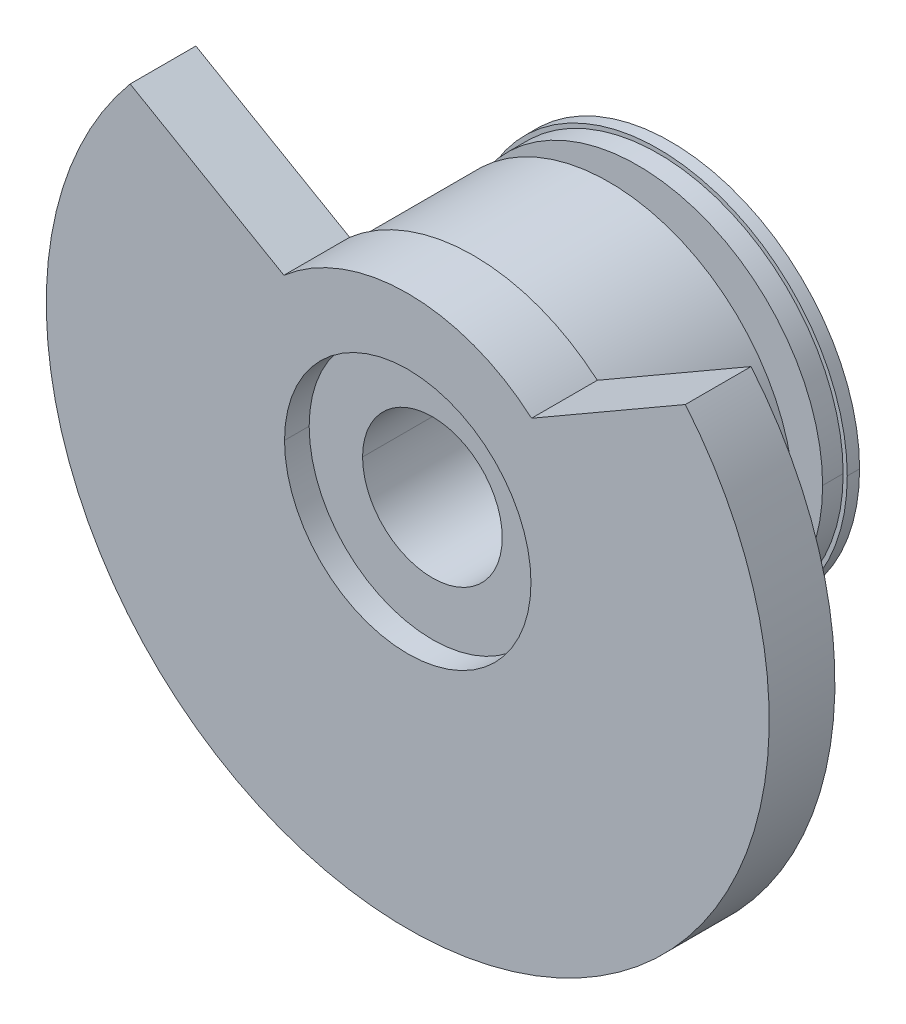
ISO-10303-21;
HEADER;
FILE_DESCRIPTION(('STEP AP214'),'2;1');
FILE_NAME('part.step','',(''),(''),'','','');
FILE_SCHEMA(('AUTOMOTIVE_DESIGN { 1 0 10303 214 1 1 1 1 }'));
ENDSEC;
DATA;
#1=APPLICATION_CONTEXT('core data for automotive mechanical design processes');
#2=APPLICATION_PROTOCOL_DEFINITION('international standard','automotive_design',2000,#1);
#3=PRODUCT_CONTEXT('',#1,'mechanical');
#4=PRODUCT('Part','Part','',(#3));
#5=PRODUCT_RELATED_PRODUCT_CATEGORY('part','',(#4));
#6=PRODUCT_DEFINITION_FORMATION('','',#4);
#7=PRODUCT_DEFINITION_CONTEXT('part definition',#1,'design');
#8=PRODUCT_DEFINITION('design','',#6,#7);
#9=PRODUCT_DEFINITION_SHAPE('','',#8);
#10=(LENGTH_UNIT() NAMED_UNIT(*) SI_UNIT(.MILLI.,.METRE.));
#11=(NAMED_UNIT(*) PLANE_ANGLE_UNIT() SI_UNIT($,.RADIAN.));
#12=(NAMED_UNIT(*) SI_UNIT($,.STERADIAN.) SOLID_ANGLE_UNIT());
#13=UNCERTAINTY_MEASURE_WITH_UNIT(LENGTH_MEASURE(1.E-05),#10,'distance_accuracy_value','');
#14=(GEOMETRIC_REPRESENTATION_CONTEXT(3) GLOBAL_UNCERTAINTY_ASSIGNED_CONTEXT((#13)) GLOBAL_UNIT_ASSIGNED_CONTEXT((#10,
#11,#12)) REPRESENTATION_CONTEXT('',''));
#15=CARTESIAN_POINT('',(0.,0.,0.));
#16=DIRECTION('',(0.,0.,1.));
#17=DIRECTION('',(1.,0.,0.));
#18=AXIS2_PLACEMENT_3D('',#15,#16,#17);
#19=CARTESIAN_POINT('',(0.,0.,-34.));
#20=DIRECTION('',(0.,0.,1.));
#21=DIRECTION('',(0.,-1.,0.));
#22=AXIS2_PLACEMENT_3D('',#19,#20,#21);
#23=CONICAL_SURFACE('',#22,19.5358983849,1.0471975512);
#24=CARTESIAN_POINT('',(0.,0.,-32.));
#25=DIRECTION('',(0.,0.,1.));
#26=DIRECTION('',(1.,0.,0.));
#27=AXIS2_PLACEMENT_3D('',#24,#25,#26);
#28=CIRCLE('',#27,23.);
#29=CARTESIAN_POINT('',(23.,0.,-32.));
#30=VERTEX_POINT('',#29);
#31=CARTESIAN_POINT('',(-23.0000000000162,0.,-32.0000000000281));
#32=VERTEX_POINT('',#31);
#33=EDGE_CURVE('E11',#30,#32,#28,.T.);
#34=ORIENTED_EDGE('',*,*,#33,.F.);
#35=DIRECTION('',(0.86602540378614,0.,0.499999999997053));
#36=VECTOR('',#35,1.);
#37=CARTESIAN_POINT('',(19.5358983849,0.,-34.));
#38=LINE('',#37,#36);
#39=CARTESIAN_POINT('',(19.535898384862,0.,-34.));
#40=VERTEX_POINT('',#39);
#41=EDGE_CURVE('E25',#40,#30,#38,.T.);
#42=ORIENTED_EDGE('',*,*,#41,.F.);
#43=CARTESIAN_POINT('',(0.,0.,-34.));
#44=DIRECTION('',(0.,0.,1.));
#45=DIRECTION('',(1.,0.,0.));
#46=AXIS2_PLACEMENT_3D('',#43,#44,#45);
#47=CIRCLE('',#46,19.5358983849);
#48=CARTESIAN_POINT('',(-19.5358983849,0.,-34.));
#49=VERTEX_POINT('',#48);
#50=EDGE_CURVE('E367',#40,#49,#47,.T.);
#51=ORIENTED_EDGE('',*,*,#50,.T.);
#52=DIRECTION('',(-0.86602540378614,0.,0.499999999997053));
#53=VECTOR('',#52,1.);
#54=CARTESIAN_POINT('',(-19.5358983849,0.,-34.));
#55=LINE('',#54,#53);
#56=EDGE_CURVE('E363',#49,#32,#55,.T.);
#57=ORIENTED_EDGE('',*,*,#56,.T.);
#58=EDGE_LOOP('',(#34,#42,#51,#57));
#59=FACE_BOUND('',#58,.T.);
#60=ADVANCED_FACE('F17',(#59),#23,.T.);
#61=CARTESIAN_POINT('',(0.,0.,-34.));
#62=DIRECTION('',(0.,0.,1.));
#63=DIRECTION('',(0.,1.,0.));
#64=AXIS2_PLACEMENT_3D('',#61,#62,#63);
#65=CONICAL_SURFACE('',#64,19.5358983849,1.0471975512);
#66=CARTESIAN_POINT('',(0.,0.,-34.));
#67=DIRECTION('',(0.,0.,1.));
#68=DIRECTION('',(1.,0.,0.));
#69=AXIS2_PLACEMENT_3D('',#66,#67,#68);
#70=CIRCLE('',#69,19.5358983849);
#71=EDGE_CURVE('E359',#49,#40,#70,.T.);
#72=ORIENTED_EDGE('',*,*,#71,.T.);
#73=ORIENTED_EDGE('',*,*,#41,.T.);
#74=CARTESIAN_POINT('',(0.,0.,-32.));
#75=DIRECTION('',(0.,0.,1.));
#76=DIRECTION('',(1.,0.,0.));
#77=AXIS2_PLACEMENT_3D('',#74,#75,#76);
#78=CIRCLE('',#77,23.);
#79=EDGE_CURVE('E354',#32,#30,#78,.T.);
#80=ORIENTED_EDGE('',*,*,#79,.F.);
#81=ORIENTED_EDGE('',*,*,#56,.F.);
#82=EDGE_LOOP('',(#72,#73,#80,#81));
#83=FACE_BOUND('',#82,.T.);
#84=ADVANCED_FACE('F377',(#83),#65,.T.);
#85=CARTESIAN_POINT('',(0.,0.,0.));
#86=DIRECTION('',(0.,0.,-1.));
#87=DIRECTION('',(0.,1.,0.));
#88=AXIS2_PLACEMENT_3D('',#85,#86,#87);
#89=CYLINDRICAL_SURFACE('',#88,23.);
#90=ORIENTED_EDGE('',*,*,#79,.T.);
#91=DIRECTION('',(0.,0.,-1.));
#92=VECTOR('',#91,1.);
#93=CARTESIAN_POINT('',(23.,0.,-30.5));
#94=LINE('',#93,#92);
#95=CARTESIAN_POINT('',(23.,0.,-30.5));
#96=VERTEX_POINT('',#95);
#97=EDGE_CURVE('E349',#96,#30,#94,.T.);
#98=ORIENTED_EDGE('',*,*,#97,.F.);
#99=CARTESIAN_POINT('',(0.,0.,-30.5));
#100=DIRECTION('',(0.,0.,1.));
#101=DIRECTION('',(1.,0.,0.));
#102=AXIS2_PLACEMENT_3D('',#99,#100,#101);
#103=CIRCLE('',#102,23.);
#104=CARTESIAN_POINT('',(-23.,0.,-30.5));
#105=VERTEX_POINT('',#104);
#106=EDGE_CURVE('E344',#105,#96,#103,.T.);
#107=ORIENTED_EDGE('',*,*,#106,.F.);
#108=DIRECTION('',(0.,0.,-1.));
#109=VECTOR('',#108,1.);
#110=CARTESIAN_POINT('',(-23.,0.,-30.5));
#111=LINE('',#110,#109);
#112=EDGE_CURVE('E339',#105,#32,#111,.T.);
#113=ORIENTED_EDGE('',*,*,#112,.T.);
#114=EDGE_LOOP('',(#90,#98,#107,#113));
#115=FACE_BOUND('',#114,.T.);
#116=ADVANCED_FACE('F382',(#115),#89,.T.);
#117=CARTESIAN_POINT('',(0.,0.,0.));
#118=DIRECTION('',(0.,0.,-1.));
#119=DIRECTION('',(0.,-1.,0.));
#120=AXIS2_PLACEMENT_3D('',#117,#118,#119);
#121=CYLINDRICAL_SURFACE('',#120,23.);
#122=CARTESIAN_POINT('',(0.,0.,-30.5));
#123=DIRECTION('',(0.,0.,1.));
#124=DIRECTION('',(1.,0.,0.));
#125=AXIS2_PLACEMENT_3D('',#122,#123,#124);
#126=CIRCLE('',#125,23.);
#127=EDGE_CURVE('E334',#96,#105,#126,.T.);
#128=ORIENTED_EDGE('',*,*,#127,.F.);
#129=ORIENTED_EDGE('',*,*,#97,.T.);
#130=ORIENTED_EDGE('',*,*,#33,.T.);
#131=ORIENTED_EDGE('',*,*,#112,.F.);
#132=EDGE_LOOP('',(#128,#129,#130,#131));
#133=FACE_BOUND('',#132,.T.);
#134=ADVANCED_FACE('F386',(#133),#121,.T.);
#135=CARTESIAN_POINT('',(0.,-23.,-30.5));
#136=DIRECTION('',(0.,0.,-1.));
#137=DIRECTION('',(-1.,0.,0.));
#138=AXIS2_PLACEMENT_3D('',#135,#136,#137);
#139=PLANE('',#138);
#140=CARTESIAN_POINT('',(0.,0.,-30.5));
#141=DIRECTION('',(0.,0.,1.));
#142=DIRECTION('',(1.,0.,0.));
#143=AXIS2_PLACEMENT_3D('',#140,#141,#142);
#144=CIRCLE('',#143,22.5);
#145=CARTESIAN_POINT('',(22.5,0.,-30.5));
#146=VERTEX_POINT('',#145);
#147=CARTESIAN_POINT('',(-22.5,0.,-30.5));
#148=VERTEX_POINT('',#147);
#149=EDGE_CURVE('E329',#146,#148,#144,.T.);
#150=ORIENTED_EDGE('',*,*,#149,.F.);
#151=CARTESIAN_POINT('',(0.,0.,-30.5));
#152=DIRECTION('',(0.,0.,1.));
#153=DIRECTION('',(1.,0.,0.));
#154=AXIS2_PLACEMENT_3D('',#151,#152,#153);
#155=CIRCLE('',#154,22.5);
#156=EDGE_CURVE('E324',#148,#146,#155,.T.);
#157=ORIENTED_EDGE('',*,*,#156,.F.);
#158=EDGE_LOOP('',(#150,#157));
#159=FACE_BOUND('',#158,.T.);
#160=ORIENTED_EDGE('',*,*,#127,.T.);
#161=ORIENTED_EDGE('',*,*,#106,.T.);
#162=EDGE_LOOP('',(#160,#161));
#163=FACE_BOUND('',#162,.T.);
#164=ADVANCED_FACE('F388',(#159,#163),#139,.F.);
#165=CARTESIAN_POINT('',(0.,0.,0.));
#166=DIRECTION('',(0.,0.,-1.));
#167=DIRECTION('',(0.,1.,0.));
#168=AXIS2_PLACEMENT_3D('',#165,#166,#167);
#169=CYLINDRICAL_SURFACE('',#168,22.5);
#170=ORIENTED_EDGE('',*,*,#156,.T.);
#171=DIRECTION('',(0.,0.,-1.));
#172=VECTOR('',#171,1.);
#173=CARTESIAN_POINT('',(22.5,0.,-28.));
#174=LINE('',#173,#172);
#175=CARTESIAN_POINT('',(22.5,0.,-28.));
#176=VERTEX_POINT('',#175);
#177=EDGE_CURVE('E319',#176,#146,#174,.T.);
#178=ORIENTED_EDGE('',*,*,#177,.F.);
#179=CARTESIAN_POINT('',(0.,0.,-28.));
#180=DIRECTION('',(0.,0.,1.));
#181=DIRECTION('',(1.,0.,0.));
#182=AXIS2_PLACEMENT_3D('',#179,#180,#181);
#183=CIRCLE('',#182,22.5);
#184=CARTESIAN_POINT('',(-22.5,0.,-28.));
#185=VERTEX_POINT('',#184);
#186=EDGE_CURVE('E314',#185,#176,#183,.T.);
#187=ORIENTED_EDGE('',*,*,#186,.F.);
#188=DIRECTION('',(0.,0.,-1.));
#189=VECTOR('',#188,1.);
#190=CARTESIAN_POINT('',(-22.5,0.,-28.));
#191=LINE('',#190,#189);
#192=EDGE_CURVE('E309',#185,#148,#191,.T.);
#193=ORIENTED_EDGE('',*,*,#192,.T.);
#194=EDGE_LOOP('',(#170,#178,#187,#193));
#195=FACE_BOUND('',#194,.T.);
#196=ADVANCED_FACE('F390',(#195),#169,.T.);
#197=CARTESIAN_POINT('',(0.,0.,0.));
#198=DIRECTION('',(0.,0.,-1.));
#199=DIRECTION('',(0.,-1.,0.));
#200=AXIS2_PLACEMENT_3D('',#197,#198,#199);
#201=CYLINDRICAL_SURFACE('',#200,22.5);
#202=CARTESIAN_POINT('',(0.,0.,-28.));
#203=DIRECTION('',(0.,0.,1.));
#204=DIRECTION('',(1.,0.,0.));
#205=AXIS2_PLACEMENT_3D('',#202,#203,#204);
#206=CIRCLE('',#205,22.5);
#207=EDGE_CURVE('E304',#176,#185,#206,.T.);
#208=ORIENTED_EDGE('',*,*,#207,.F.);
#209=ORIENTED_EDGE('',*,*,#177,.T.);
#210=ORIENTED_EDGE('',*,*,#149,.T.);
#211=ORIENTED_EDGE('',*,*,#192,.F.);
#212=EDGE_LOOP('',(#208,#209,#210,#211));
#213=FACE_BOUND('',#212,.T.);
#214=ADVANCED_FACE('F398',(#213),#201,.T.);
#215=CARTESIAN_POINT('',(0.,-22.5,-28.));
#216=DIRECTION('',(0.,0.,-1.));
#217=DIRECTION('',(-1.,0.,0.));
#218=AXIS2_PLACEMENT_3D('',#215,#216,#217);
#219=PLANE('',#218);
#220=CARTESIAN_POINT('',(0.,0.,-28.));
#221=DIRECTION('',(0.,0.,1.));
#222=DIRECTION('',(1.,0.,0.));
#223=AXIS2_PLACEMENT_3D('',#220,#221,#222);
#224=CIRCLE('',#223,17.5);
#225=CARTESIAN_POINT('',(17.5,0.,-28.));
#226=VERTEX_POINT('',#225);
#227=CARTESIAN_POINT('',(-17.5,0.,-28.));
#228=VERTEX_POINT('',#227);
#229=EDGE_CURVE('E299',#226,#228,#224,.T.);
#230=ORIENTED_EDGE('',*,*,#229,.F.);
#231=CARTESIAN_POINT('',(0.,0.,-28.));
#232=DIRECTION('',(0.,0.,1.));
#233=DIRECTION('',(1.,0.,0.));
#234=AXIS2_PLACEMENT_3D('',#231,#232,#233);
#235=CIRCLE('',#234,17.5);
#236=EDGE_CURVE('E294',#228,#226,#235,.T.);
#237=ORIENTED_EDGE('',*,*,#236,.F.);
#238=EDGE_LOOP('',(#230,#237));
#239=FACE_BOUND('',#238,.T.);
#240=ORIENTED_EDGE('',*,*,#207,.T.);
#241=ORIENTED_EDGE('',*,*,#186,.T.);
#242=EDGE_LOOP('',(#240,#241));
#243=FACE_BOUND('',#242,.T.);
#244=ADVANCED_FACE('F439',(#239,#243),#219,.F.);
#245=CARTESIAN_POINT('',(0.,0.,0.));
#246=DIRECTION('',(0.,0.,-1.));
#247=DIRECTION('',(0.,1.,0.));
#248=AXIS2_PLACEMENT_3D('',#245,#246,#247);
#249=CYLINDRICAL_SURFACE('',#248,17.5);
#250=ORIENTED_EDGE('',*,*,#236,.T.);
#251=DIRECTION('',(0.,0.,-1.));
#252=VECTOR('',#251,1.);
#253=CARTESIAN_POINT('',(17.5,0.,-24.5));
#254=LINE('',#253,#252);
#255=CARTESIAN_POINT('',(17.5,0.,-24.5));
#256=VERTEX_POINT('',#255);
#257=EDGE_CURVE('E289',#256,#226,#254,.T.);
#258=ORIENTED_EDGE('',*,*,#257,.F.);
#259=CARTESIAN_POINT('',(0.,0.,-24.5));
#260=DIRECTION('',(0.,0.,1.));
#261=DIRECTION('',(1.,0.,0.));
#262=AXIS2_PLACEMENT_3D('',#259,#260,#261);
#263=CIRCLE('',#262,17.5);
#264=CARTESIAN_POINT('',(-17.5,0.,-24.5));
#265=VERTEX_POINT('',#264);
#266=EDGE_CURVE('E284',#265,#256,#263,.T.);
#267=ORIENTED_EDGE('',*,*,#266,.F.);
#268=DIRECTION('',(0.,0.,-1.));
#269=VECTOR('',#268,1.);
#270=CARTESIAN_POINT('',(-17.5,0.,-24.5));
#271=LINE('',#270,#269);
#272=EDGE_CURVE('E279',#265,#228,#271,.T.);
#273=ORIENTED_EDGE('',*,*,#272,.T.);
#274=EDGE_LOOP('',(#250,#258,#267,#273));
#275=FACE_BOUND('',#274,.T.);
#276=ADVANCED_FACE('F449',(#275),#249,.T.);
#277=CARTESIAN_POINT('',(0.,0.,0.));
#278=DIRECTION('',(0.,0.,-1.));
#279=DIRECTION('',(0.,-1.,0.));
#280=AXIS2_PLACEMENT_3D('',#277,#278,#279);
#281=CYLINDRICAL_SURFACE('',#280,17.5);
#282=CARTESIAN_POINT('',(0.,0.,-24.5));
#283=DIRECTION('',(0.,0.,1.));
#284=DIRECTION('',(1.,0.,0.));
#285=AXIS2_PLACEMENT_3D('',#282,#283,#284);
#286=CIRCLE('',#285,17.5);
#287=EDGE_CURVE('E274',#256,#265,#286,.T.);
#288=ORIENTED_EDGE('',*,*,#287,.F.);
#289=ORIENTED_EDGE('',*,*,#257,.T.);
#290=ORIENTED_EDGE('',*,*,#229,.T.);
#291=ORIENTED_EDGE('',*,*,#272,.F.);
#292=EDGE_LOOP('',(#288,#289,#290,#291));
#293=FACE_BOUND('',#292,.T.);
#294=ADVANCED_FACE('F459',(#293),#281,.T.);
#295=CARTESIAN_POINT('',(0.,-17.5,-24.5));
#296=DIRECTION('',(0.,0.,1.));
#297=DIRECTION('',(1.,0.,0.));
#298=AXIS2_PLACEMENT_3D('',#295,#296,#297);
#299=PLANE('',#298);
#300=CARTESIAN_POINT('',(0.,0.,-24.5));
#301=DIRECTION('',(0.,0.,1.));
#302=DIRECTION('',(1.,0.,0.));
#303=AXIS2_PLACEMENT_3D('',#300,#301,#302);
#304=CIRCLE('',#303,22.5);
#305=CARTESIAN_POINT('',(22.5,0.,-24.5));
#306=VERTEX_POINT('',#305);
#307=CARTESIAN_POINT('',(-22.5,0.,-24.5));
#308=VERTEX_POINT('',#307);
#309=EDGE_CURVE('E269',#306,#308,#304,.T.);
#310=ORIENTED_EDGE('',*,*,#309,.F.);
#311=CARTESIAN_POINT('',(0.,0.,-24.5));
#312=DIRECTION('',(0.,0.,1.));
#313=DIRECTION('',(1.,0.,0.));
#314=AXIS2_PLACEMENT_3D('',#311,#312,#313);
#315=CIRCLE('',#314,22.5);
#316=EDGE_CURVE('E264',#308,#306,#315,.T.);
#317=ORIENTED_EDGE('',*,*,#316,.F.);
#318=EDGE_LOOP('',(#310,#317));
#319=FACE_BOUND('',#318,.T.);
#320=ORIENTED_EDGE('',*,*,#287,.T.);
#321=ORIENTED_EDGE('',*,*,#266,.T.);
#322=EDGE_LOOP('',(#320,#321));
#323=FACE_BOUND('',#322,.T.);
#324=ADVANCED_FACE('F469',(#319,#323),#299,.F.);
#325=CARTESIAN_POINT('',(0.,0.,0.));
#326=DIRECTION('',(0.,0.,-1.));
#327=DIRECTION('',(0.,1.,0.));
#328=AXIS2_PLACEMENT_3D('',#325,#326,#327);
#329=CYLINDRICAL_SURFACE('',#328,22.5);
#330=ORIENTED_EDGE('',*,*,#316,.T.);
#331=DIRECTION('',(0.,0.,-1.));
#332=VECTOR('',#331,1.);
#333=CARTESIAN_POINT('',(22.5,0.,-8.));
#334=LINE('',#333,#332);
#335=CARTESIAN_POINT('',(22.5,0.,-8.));
#336=VERTEX_POINT('',#335);
#337=EDGE_CURVE('E259',#336,#306,#334,.T.);
#338=ORIENTED_EDGE('',*,*,#337,.F.);
#339=CARTESIAN_POINT('',(0.,0.,-8.));
#340=DIRECTION('',(0.,0.,1.));
#341=DIRECTION('',(1.,0.,0.));
#342=AXIS2_PLACEMENT_3D('',#339,#340,#341);
#343=CIRCLE('',#342,22.5);
#344=CARTESIAN_POINT('',(-22.5,0.,-8.));
#345=VERTEX_POINT('',#344);
#346=EDGE_CURVE('E254',#345,#336,#343,.T.);
#347=ORIENTED_EDGE('',*,*,#346,.F.);
#348=DIRECTION('',(0.,0.,-1.));
#349=VECTOR('',#348,1.);
#350=CARTESIAN_POINT('',(-22.5,0.,-8.));
#351=LINE('',#350,#349);
#352=EDGE_CURVE('E249',#345,#308,#351,.T.);
#353=ORIENTED_EDGE('',*,*,#352,.T.);
#354=EDGE_LOOP('',(#330,#338,#347,#353));
#355=FACE_BOUND('',#354,.T.);
#356=ADVANCED_FACE('F479',(#355),#329,.T.);
#357=CARTESIAN_POINT('',(0.,0.,0.));
#358=DIRECTION('',(0.,0.,-1.));
#359=DIRECTION('',(0.,-1.,0.));
#360=AXIS2_PLACEMENT_3D('',#357,#358,#359);
#361=CYLINDRICAL_SURFACE('',#360,22.5);
#362=CARTESIAN_POINT('',(0.,0.,-8.));
#363=DIRECTION('',(0.,0.,1.));
#364=DIRECTION('',(1.,0.,0.));
#365=AXIS2_PLACEMENT_3D('',#362,#363,#364);
#366=CIRCLE('',#365,22.5);
#367=EDGE_CURVE('E244',#336,#345,#366,.T.);
#368=ORIENTED_EDGE('',*,*,#367,.F.);
#369=ORIENTED_EDGE('',*,*,#337,.T.);
#370=ORIENTED_EDGE('',*,*,#309,.T.);
#371=ORIENTED_EDGE('',*,*,#352,.F.);
#372=EDGE_LOOP('',(#368,#369,#370,#371));
#373=FACE_BOUND('',#372,.T.);
#374=ADVANCED_FACE('F489',(#373),#361,.T.);
#375=CARTESIAN_POINT('',(0.,-22.5,-8.));
#376=DIRECTION('',(0.,0.,1.));
#377=DIRECTION('',(1.,0.,0.));
#378=AXIS2_PLACEMENT_3D('',#375,#376,#377);
#379=PLANE('',#378);
#380=CARTESIAN_POINT('',(0.,0.,-8.));
#381=DIRECTION('',(0.,0.,1.));
#382=DIRECTION('',(1.,0.,0.));
#383=AXIS2_PLACEMENT_3D('',#380,#381,#382);
#384=CIRCLE('',#383,44.);
#385=CARTESIAN_POINT('',(-33.791984659499,28.179811439614,-8.));
#386=VERTEX_POINT('',#385);
#387=CARTESIAN_POINT('',(33.791984659499,28.179811439614,-8.));
#388=VERTEX_POINT('',#387);
#389=EDGE_CURVE('E239',#386,#388,#384,.T.);
#390=ORIENTED_EDGE('',*,*,#389,.F.);
#391=DIRECTION('',(0.866025403784419,-0.500000000000033,0.));
#392=VECTOR('',#391,1.);
#393=CARTESIAN_POINT('',(-33.791984659499,28.179811439614,-8.));
#394=LINE('',#393,#392);
#395=CARTESIAN_POINT('',(-15.073087004134,17.372450839355,-8.));
#396=VERTEX_POINT('',#395);
#397=EDGE_CURVE('E235',#386,#396,#394,.T.);
#398=ORIENTED_EDGE('',*,*,#397,.T.);
#399=CARTESIAN_POINT('',(0.,0.,-8.));
#400=DIRECTION('',(0.,0.,1.));
#401=DIRECTION('',(1.,0.,0.));
#402=AXIS2_PLACEMENT_3D('',#399,#400,#401);
#403=CIRCLE('',#402,23.);
#404=CARTESIAN_POINT('',(15.073087004134,17.372450839355,-8.));
#405=VERTEX_POINT('',#404);
#406=EDGE_CURVE('E230',#405,#396,#403,.T.);
#407=ORIENTED_EDGE('',*,*,#406,.F.);
#408=DIRECTION('',(0.866025403784419,0.500000000000033,0.));
#409=VECTOR('',#408,1.);
#410=CARTESIAN_POINT('',(15.073087004134,17.372450839355,-8.));
#411=LINE('',#410,#409);
#412=EDGE_CURVE('E226',#405,#388,#411,.T.);
#413=ORIENTED_EDGE('',*,*,#412,.T.);
#414=EDGE_LOOP('',(#390,#398,#407,#413));
#415=FACE_BOUND('',#414,.T.);
#416=ORIENTED_EDGE('',*,*,#367,.T.);
#417=ORIENTED_EDGE('',*,*,#346,.T.);
#418=EDGE_LOOP('',(#416,#417));
#419=FACE_BOUND('',#418,.T.);
#420=ADVANCED_FACE('F499',(#415,#419),#379,.F.);
#421=CARTESIAN_POINT('',(15.073087004134,17.372450839355,-8.));
#422=DIRECTION('',(0.500000000000033,-0.866025403784419,0.));
#423=DIRECTION('',(0.866025403784419,0.500000000000033,0.));
#424=AXIS2_PLACEMENT_3D('',#421,#422,#423);
#425=PLANE('',#424);
#426=DIRECTION('',(0.866025403784419,0.500000000000033,0.));
#427=VECTOR('',#426,1.);
#428=CARTESIAN_POINT('',(15.073087004134,17.372450839355,0.));
#429=LINE('',#428,#427);
#430=CARTESIAN_POINT('',(15.073087004134,17.372450839355,0.));
#431=VERTEX_POINT('',#430);
#432=CARTESIAN_POINT('',(33.791984659499,28.179811439614,0.));
#433=VERTEX_POINT('',#432);
#434=EDGE_CURVE('E222',#431,#433,#429,.T.);
#435=ORIENTED_EDGE('',*,*,#434,.T.);
#436=DIRECTION('',(0.,0.,1.));
#437=VECTOR('',#436,1.);
#438=CARTESIAN_POINT('',(33.791984659499,28.179811439614,-8.));
#439=LINE('',#438,#437);
#440=EDGE_CURVE('E217',#388,#433,#439,.T.);
#441=ORIENTED_EDGE('',*,*,#440,.F.);
#442=ORIENTED_EDGE('',*,*,#412,.F.);
#443=DIRECTION('',(0.,0.,1.));
#444=VECTOR('',#443,1.);
#445=CARTESIAN_POINT('',(15.073087004134,17.372450839355,-8.));
#446=LINE('',#445,#444);
#447=EDGE_CURVE('E213',#405,#431,#446,.T.);
#448=ORIENTED_EDGE('',*,*,#447,.T.);
#449=EDGE_LOOP('',(#435,#441,#442,#448));
#450=FACE_BOUND('',#449,.T.);
#451=ADVANCED_FACE('F509',(#450),#425,.F.);
#452=CARTESIAN_POINT('',(0.,0.,-8.));
#453=DIRECTION('',(0.,0.,-1.));
#454=DIRECTION('',(0.,-1.,0.));
#455=AXIS2_PLACEMENT_3D('',#452,#453,#454);
#456=CYLINDRICAL_SURFACE('',#455,23.);
#457=CARTESIAN_POINT('',(0.,0.,0.));
#458=DIRECTION('',(0.,0.,1.));
#459=DIRECTION('',(1.,0.,0.));
#460=AXIS2_PLACEMENT_3D('',#457,#458,#459);
#461=CIRCLE('',#460,23.);
#462=CARTESIAN_POINT('',(-15.073087004134,17.372450839355,0.));
#463=VERTEX_POINT('',#462);
#464=EDGE_CURVE('E208',#431,#463,#461,.T.);
#465=ORIENTED_EDGE('',*,*,#464,.F.);
#466=ORIENTED_EDGE('',*,*,#447,.F.);
#467=ORIENTED_EDGE('',*,*,#406,.T.);
#468=DIRECTION('',(0.,0.,1.));
#469=VECTOR('',#468,1.);
#470=CARTESIAN_POINT('',(-15.073087004134,17.372450839355,-8.));
#471=LINE('',#470,#469);
#472=EDGE_CURVE('E204',#396,#463,#471,.T.);
#473=ORIENTED_EDGE('',*,*,#472,.T.);
#474=EDGE_LOOP('',(#465,#466,#467,#473));
#475=FACE_BOUND('',#474,.T.);
#476=ADVANCED_FACE('F519',(#475),#456,.T.);
#477=CARTESIAN_POINT('',(-33.791984659499,28.179811439614,-8.));
#478=DIRECTION('',(-0.500000000000033,-0.866025403784419,0.));
#479=DIRECTION('',(0.866025403784419,-0.500000000000033,0.));
#480=AXIS2_PLACEMENT_3D('',#477,#478,#479);
#481=PLANE('',#480);
#482=DIRECTION('',(0.866025403784419,-0.500000000000033,0.));
#483=VECTOR('',#482,1.);
#484=CARTESIAN_POINT('',(-33.791984659499,28.179811439614,0.));
#485=LINE('',#484,#483);
#486=CARTESIAN_POINT('',(-33.791984659499,28.179811439614,0.));
#487=VERTEX_POINT('',#486);
#488=EDGE_CURVE('E199',#487,#463,#485,.T.);
#489=ORIENTED_EDGE('',*,*,#488,.T.);
#490=ORIENTED_EDGE('',*,*,#472,.F.);
#491=ORIENTED_EDGE('',*,*,#397,.F.);
#492=DIRECTION('',(0.,0.,1.));
#493=VECTOR('',#492,1.);
#494=CARTESIAN_POINT('',(-33.791984659499,28.179811439614,-8.));
#495=LINE('',#494,#493);
#496=EDGE_CURVE('E195',#386,#487,#495,.T.);
#497=ORIENTED_EDGE('',*,*,#496,.T.);
#498=EDGE_LOOP('',(#489,#490,#491,#497));
#499=FACE_BOUND('',#498,.T.);
#500=ADVANCED_FACE('F529',(#499),#481,.F.);
#501=CARTESIAN_POINT('',(0.,0.,0.));
#502=DIRECTION('',(0.,0.,-1.));
#503=DIRECTION('',(0.,1.,0.));
#504=AXIS2_PLACEMENT_3D('',#501,#502,#503);
#505=CYLINDRICAL_SURFACE('',#504,44.);
#506=ORIENTED_EDGE('',*,*,#389,.T.);
#507=ORIENTED_EDGE('',*,*,#440,.T.);
#508=CARTESIAN_POINT('',(0.,0.,0.));
#509=DIRECTION('',(0.,0.,1.));
#510=DIRECTION('',(1.,0.,0.));
#511=AXIS2_PLACEMENT_3D('',#508,#509,#510);
#512=CIRCLE('',#511,44.);
#513=EDGE_CURVE('E190',#487,#433,#512,.T.);
#514=ORIENTED_EDGE('',*,*,#513,.F.);
#515=ORIENTED_EDGE('',*,*,#496,.F.);
#516=EDGE_LOOP('',(#506,#507,#514,#515));
#517=FACE_BOUND('',#516,.T.);
#518=ADVANCED_FACE('F539',(#517),#505,.T.);
#519=CARTESIAN_POINT('',(0.,-44.,0.));
#520=DIRECTION('',(0.,0.,-1.));
#521=DIRECTION('',(-1.,0.,0.));
#522=AXIS2_PLACEMENT_3D('',#519,#520,#521);
#523=PLANE('',#522);
#524=CARTESIAN_POINT('',(0.,0.,0.));
#525=DIRECTION('',(0.,0.,1.));
#526=DIRECTION('',(1.,0.,0.));
#527=AXIS2_PLACEMENT_3D('',#524,#525,#526);
#528=CIRCLE('',#527,15.);
#529=CARTESIAN_POINT('',(15.,0.,0.));
#530=VERTEX_POINT('',#529);
#531=CARTESIAN_POINT('',(-15.,0.,0.));
#532=VERTEX_POINT('',#531);
#533=EDGE_CURVE('E185',#530,#532,#528,.T.);
#534=ORIENTED_EDGE('',*,*,#533,.F.);
#535=CARTESIAN_POINT('',(0.,0.,0.));
#536=DIRECTION('',(0.,0.,1.));
#537=DIRECTION('',(1.,0.,0.));
#538=AXIS2_PLACEMENT_3D('',#535,#536,#537);
#539=CIRCLE('',#538,15.);
#540=EDGE_CURVE('E180',#532,#530,#539,.T.);
#541=ORIENTED_EDGE('',*,*,#540,.F.);
#542=EDGE_LOOP('',(#534,#541));
#543=FACE_BOUND('',#542,.T.);
#544=ORIENTED_EDGE('',*,*,#464,.T.);
#545=ORIENTED_EDGE('',*,*,#488,.F.);
#546=ORIENTED_EDGE('',*,*,#513,.T.);
#547=ORIENTED_EDGE('',*,*,#434,.F.);
#548=EDGE_LOOP('',(#544,#545,#546,#547));
#549=FACE_BOUND('',#548,.T.);
#550=ADVANCED_FACE('F549',(#543,#549),#523,.F.);
#551=CARTESIAN_POINT('',(0.,0.,0.));
#552=DIRECTION('',(0.,0.,-1.));
#553=DIRECTION('',(0.,1.,0.));
#554=AXIS2_PLACEMENT_3D('',#551,#552,#553);
#555=CYLINDRICAL_SURFACE('',#554,15.);
#556=CARTESIAN_POINT('',(0.,0.,-3.));
#557=DIRECTION('',(0.,0.,1.));
#558=DIRECTION('',(1.,0.,0.));
#559=AXIS2_PLACEMENT_3D('',#556,#557,#558);
#560=CIRCLE('',#559,15.);
#561=CARTESIAN_POINT('',(-15.,0.,-3.));
#562=VERTEX_POINT('',#561);
#563=CARTESIAN_POINT('',(15.,0.,-3.));
#564=VERTEX_POINT('',#563);
#565=EDGE_CURVE('E175',#562,#564,#560,.T.);
#566=ORIENTED_EDGE('',*,*,#565,.F.);
#567=DIRECTION('',(0.,0.,-1.));
#568=VECTOR('',#567,1.);
#569=CARTESIAN_POINT('',(-15.,0.,0.));
#570=LINE('',#569,#568);
#571=EDGE_CURVE('E170',#532,#562,#570,.T.);
#572=ORIENTED_EDGE('',*,*,#571,.F.);
#573=ORIENTED_EDGE('',*,*,#540,.T.);
#574=DIRECTION('',(0.,0.,-1.));
#575=VECTOR('',#574,1.);
#576=CARTESIAN_POINT('',(15.,0.,0.));
#577=LINE('',#576,#575);
#578=EDGE_CURVE('E166',#530,#564,#577,.T.);
#579=ORIENTED_EDGE('',*,*,#578,.T.);
#580=EDGE_LOOP('',(#566,#572,#573,#579));
#581=FACE_BOUND('',#580,.T.);
#582=ADVANCED_FACE('F559',(#581),#555,.F.);
#583=CARTESIAN_POINT('',(0.,0.,0.));
#584=DIRECTION('',(0.,0.,-1.));
#585=DIRECTION('',(0.,-1.,0.));
#586=AXIS2_PLACEMENT_3D('',#583,#584,#585);
#587=CYLINDRICAL_SURFACE('',#586,15.);
#588=ORIENTED_EDGE('',*,*,#533,.T.);
#589=ORIENTED_EDGE('',*,*,#571,.T.);
#590=CARTESIAN_POINT('',(0.,0.,-3.));
#591=DIRECTION('',(0.,0.,1.));
#592=DIRECTION('',(1.,0.,0.));
#593=AXIS2_PLACEMENT_3D('',#590,#591,#592);
#594=CIRCLE('',#593,15.);
#595=EDGE_CURVE('E161',#564,#562,#594,.T.);
#596=ORIENTED_EDGE('',*,*,#595,.F.);
#597=ORIENTED_EDGE('',*,*,#578,.F.);
#598=EDGE_LOOP('',(#588,#589,#596,#597));
#599=FACE_BOUND('',#598,.T.);
#600=ADVANCED_FACE('F569',(#599),#587,.F.);
#601=CARTESIAN_POINT('',(0.,-15.,-3.));
#602=DIRECTION('',(0.,0.,-1.));
#603=DIRECTION('',(-1.,0.,0.));
#604=AXIS2_PLACEMENT_3D('',#601,#602,#603);
#605=PLANE('',#604);
#606=CARTESIAN_POINT('',(0.,0.,-3.));
#607=DIRECTION('',(0.,0.,1.));
#608=DIRECTION('',(1.,0.,0.));
#609=AXIS2_PLACEMENT_3D('',#606,#607,#608);
#610=CIRCLE('',#609,8.5);
#611=CARTESIAN_POINT('',(8.5,0.,-3.));
#612=VERTEX_POINT('',#611);
#613=CARTESIAN_POINT('',(-8.5,0.,-3.));
#614=VERTEX_POINT('',#613);
#615=EDGE_CURVE('E150',#612,#614,#610,.T.);
#616=ORIENTED_EDGE('',*,*,#615,.F.);
#617=CARTESIAN_POINT('',(0.,0.,-3.));
#618=DIRECTION('',(0.,0.,1.));
#619=DIRECTION('',(1.,0.,0.));
#620=AXIS2_PLACEMENT_3D('',#617,#618,#619);
#621=CIRCLE('',#620,8.5);
#622=EDGE_CURVE('E138',#614,#612,#621,.T.);
#623=ORIENTED_EDGE('',*,*,#622,.F.);
#624=EDGE_LOOP('',(#616,#623));
#625=FACE_BOUND('',#624,.T.);
#626=ORIENTED_EDGE('',*,*,#595,.T.);
#627=ORIENTED_EDGE('',*,*,#565,.T.);
#628=EDGE_LOOP('',(#626,#627));
#629=FACE_BOUND('',#628,.T.);
#630=ADVANCED_FACE('F579',(#625,#629),#605,.F.);
#631=CARTESIAN_POINT('',(0.,0.,0.));
#632=DIRECTION('',(0.,0.,-1.));
#633=DIRECTION('',(0.,1.,0.));
#634=AXIS2_PLACEMENT_3D('',#631,#632,#633);
#635=CYLINDRICAL_SURFACE('',#634,8.5);
#636=CARTESIAN_POINT('',(0.,0.,-23.5));
#637=DIRECTION('',(0.,0.,1.));
#638=DIRECTION('',(1.,0.,0.));
#639=AXIS2_PLACEMENT_3D('',#636,#637,#638);
#640=CIRCLE('',#639,8.5);
#641=CARTESIAN_POINT('',(-8.5,0.,-23.5));
#642=VERTEX_POINT('',#641);
#643=CARTESIAN_POINT('',(8.5,0.,-23.5));
#644=VERTEX_POINT('',#643);
#645=EDGE_CURVE('E136',#642,#644,#640,.T.);
#646=ORIENTED_EDGE('',*,*,#645,.F.);
#647=DIRECTION('',(0.,0.,-1.));
#648=VECTOR('',#647,1.);
#649=CARTESIAN_POINT('',(-8.5,0.,-3.));
#650=LINE('',#649,#648);
#651=EDGE_CURVE('E141',#614,#642,#650,.T.);
#652=ORIENTED_EDGE('',*,*,#651,.F.);
#653=ORIENTED_EDGE('',*,*,#622,.T.);
#654=DIRECTION('',(0.,0.,-1.));
#655=VECTOR('',#654,1.);
#656=CARTESIAN_POINT('',(8.5,0.,-3.));
#657=LINE('',#656,#655);
#658=EDGE_CURVE('E131',#612,#644,#657,.T.);
#659=ORIENTED_EDGE('',*,*,#658,.T.);
#660=EDGE_LOOP('',(#646,#652,#653,#659));
#661=FACE_BOUND('',#660,.T.);
#662=ADVANCED_FACE('F133',(#661),#635,.F.);
#663=CARTESIAN_POINT('',(0.,0.,0.));
#664=DIRECTION('',(0.,0.,-1.));
#665=DIRECTION('',(0.,-1.,0.));
#666=AXIS2_PLACEMENT_3D('',#663,#664,#665);
#667=CYLINDRICAL_SURFACE('',#666,8.5);
#668=ORIENTED_EDGE('',*,*,#615,.T.);
#669=ORIENTED_EDGE('',*,*,#651,.T.);
#670=CARTESIAN_POINT('',(0.,0.,-23.5));
#671=DIRECTION('',(0.,0.,1.));
#672=DIRECTION('',(1.,0.,0.));
#673=AXIS2_PLACEMENT_3D('',#670,#671,#672);
#674=CIRCLE('',#673,8.5);
#675=EDGE_CURVE('E142',#644,#642,#674,.T.);
#676=ORIENTED_EDGE('',*,*,#675,.F.);
#677=ORIENTED_EDGE('',*,*,#658,.F.);
#678=EDGE_LOOP('',(#668,#669,#676,#677));
#679=FACE_BOUND('',#678,.T.);
#680=ADVANCED_FACE('F145',(#679),#667,.F.);
#681=CARTESIAN_POINT('',(0.,-8.5,-23.5));
#682=DIRECTION('',(0.,0.,-1.));
#683=DIRECTION('',(-1.,0.,0.));
#684=AXIS2_PLACEMENT_3D('',#681,#682,#683);
#685=PLANE('',#684);
#686=ORIENTED_EDGE('',*,*,#675,.T.);
#687=ORIENTED_EDGE('',*,*,#645,.T.);
#688=EDGE_LOOP('',(#686,#687));
#689=FACE_BOUND('',#688,.T.);
#690=ADVANCED_FACE('F148',(#689),#685,.F.);
#691=CARTESIAN_POINT('',(0.,0.,-34.));
#692=DIRECTION('',(0.,0.,1.));
#693=DIRECTION('',(1.,0.,0.));
#694=AXIS2_PLACEMENT_3D('',#691,#692,#693);
#695=PLANE('',#694);
#696=ORIENTED_EDGE('',*,*,#50,.F.);
#697=ORIENTED_EDGE('',*,*,#71,.F.);
#698=EDGE_LOOP('',(#696,#697));
#699=FACE_BOUND('',#698,.T.);
#700=ADVANCED_FACE('F614',(#699),#695,.F.);
#701=CLOSED_SHELL('',(#60,#84,#116,#134,#164,#196,#214,#244,#276,#294,#324,#356,#374,#420,#451,
#476,#500,#518,#550,#582,#600,#630,#662,#680,#690,#700));
#702=MANIFOLD_SOLID_BREP('B1',#701);
#703=ADVANCED_BREP_SHAPE_REPRESENTATION('',(#18,#702),#14);
#704=SHAPE_DEFINITION_REPRESENTATION(#9,#703);
ENDSEC;
END-ISO-10303-21;
